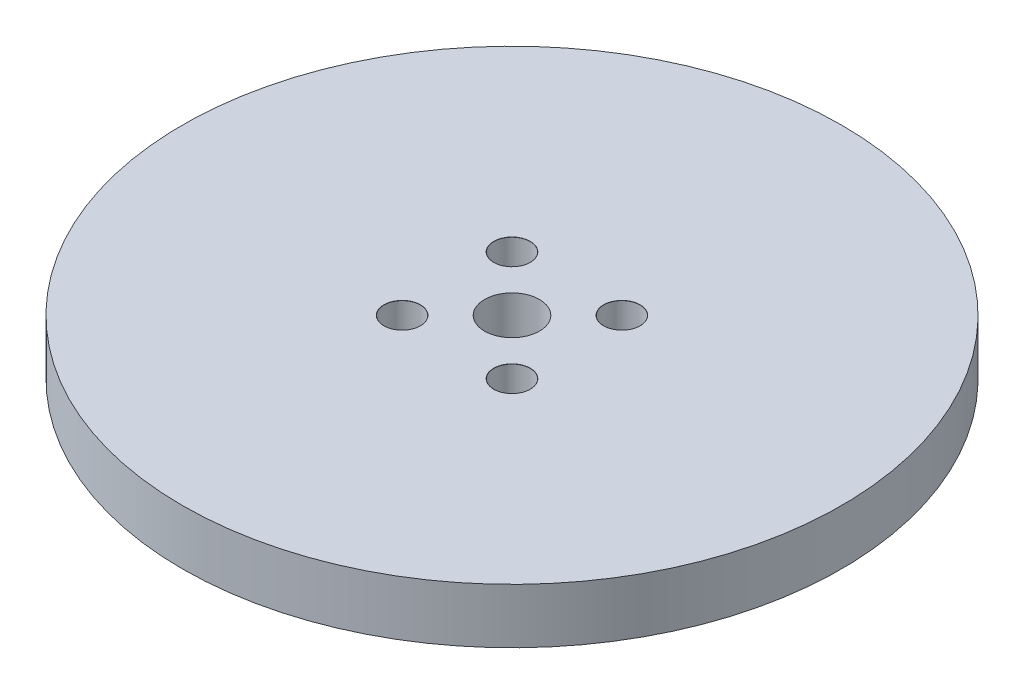
ISO-10303-21;
HEADER;
FILE_DESCRIPTION(('STEP AP214'),'2;1');
FILE_NAME('part.step','',(''),(''),'','','');
FILE_SCHEMA(('AUTOMOTIVE_DESIGN { 1 0 10303 214 1 1 1 1 }'));
ENDSEC;
DATA;
#1=APPLICATION_CONTEXT('core data for automotive mechanical design processes');
#2=APPLICATION_PROTOCOL_DEFINITION('international standard','automotive_design',2000,#1);
#3=PRODUCT_CONTEXT('',#1,'mechanical');
#4=PRODUCT('Part','Part','',(#3));
#5=PRODUCT_RELATED_PRODUCT_CATEGORY('part','',(#4));
#6=PRODUCT_DEFINITION_FORMATION('','',#4);
#7=PRODUCT_DEFINITION_CONTEXT('part definition',#1,'design');
#8=PRODUCT_DEFINITION('design','',#6,#7);
#9=PRODUCT_DEFINITION_SHAPE('','',#8);
#10=(LENGTH_UNIT() NAMED_UNIT(*) SI_UNIT(.MILLI.,.METRE.));
#11=(NAMED_UNIT(*) PLANE_ANGLE_UNIT() SI_UNIT($,.RADIAN.));
#12=(NAMED_UNIT(*) SI_UNIT($,.STERADIAN.) SOLID_ANGLE_UNIT());
#13=UNCERTAINTY_MEASURE_WITH_UNIT(LENGTH_MEASURE(1.E-05),#10,'distance_accuracy_value','');
#14=(GEOMETRIC_REPRESENTATION_CONTEXT(3) GLOBAL_UNCERTAINTY_ASSIGNED_CONTEXT((#13)) GLOBAL_UNIT_ASSIGNED_CONTEXT((#10,
#11,#12)) REPRESENTATION_CONTEXT('',''));
#15=CARTESIAN_POINT('',(0.,0.,0.));
#16=DIRECTION('',(0.,0.,1.));
#17=DIRECTION('',(1.,0.,0.));
#18=AXIS2_PLACEMENT_3D('',#15,#16,#17);
#19=CARTESIAN_POINT('',(0.,10.,0.));
#20=DIRECTION('',(0.,1.,0.));
#21=DIRECTION('',(0.,0.,1.));
#22=AXIS2_PLACEMENT_3D('',#19,#20,#21);
#23=PLANE('',#22);
#24=CARTESIAN_POINT('',(-10.,10.,-10.));
#25=DIRECTION('',(0.,1.,0.));
#26=DIRECTION('',(0.,0.,1.));
#27=AXIS2_PLACEMENT_3D('',#24,#25,#26);
#28=CIRCLE('',#27,3.325);
#29=CARTESIAN_POINT('',(-10.,10.,-6.675));
#30=VERTEX_POINT('',#29);
#31=EDGE_CURVE('E96',#30,#30,#28,.T.);
#32=ORIENTED_EDGE('',*,*,#31,.F.);
#33=EDGE_LOOP('',(#32));
#34=FACE_BOUND('',#33,.T.);
#35=CARTESIAN_POINT('',(10.,10.,-10.));
#36=DIRECTION('',(0.,1.,0.));
#37=DIRECTION('',(0.,0.,1.));
#38=AXIS2_PLACEMENT_3D('',#35,#36,#37);
#39=CIRCLE('',#38,3.325);
#40=CARTESIAN_POINT('',(10.,10.,-6.675));
#41=VERTEX_POINT('',#40);
#42=EDGE_CURVE('E87',#41,#41,#39,.T.);
#43=ORIENTED_EDGE('',*,*,#42,.F.);
#44=EDGE_LOOP('',(#43));
#45=FACE_BOUND('',#44,.T.);
#46=CARTESIAN_POINT('',(-10.,10.,10.));
#47=DIRECTION('',(0.,1.,0.));
#48=DIRECTION('',(0.,0.,1.));
#49=AXIS2_PLACEMENT_3D('',#46,#47,#48);
#50=CIRCLE('',#49,3.325);
#51=CARTESIAN_POINT('',(-10.,10.,13.325));
#52=VERTEX_POINT('',#51);
#53=EDGE_CURVE('E78',#52,#52,#50,.T.);
#54=ORIENTED_EDGE('',*,*,#53,.F.);
#55=EDGE_LOOP('',(#54));
#56=FACE_BOUND('',#55,.T.);
#57=CARTESIAN_POINT('',(10.,10.,10.));
#58=DIRECTION('',(0.,1.,0.));
#59=DIRECTION('',(0.,0.,1.));
#60=AXIS2_PLACEMENT_3D('',#57,#58,#59);
#61=CIRCLE('',#60,3.325);
#62=CARTESIAN_POINT('',(10.,10.,13.325));
#63=VERTEX_POINT('',#62);
#64=EDGE_CURVE('E69',#63,#63,#61,.T.);
#65=ORIENTED_EDGE('',*,*,#64,.F.);
#66=EDGE_LOOP('',(#65));
#67=FACE_BOUND('',#66,.T.);
#68=CARTESIAN_POINT('',(0.,10.,0.));
#69=DIRECTION('',(0.,1.,0.));
#70=DIRECTION('',(0.,0.,1.));
#71=AXIS2_PLACEMENT_3D('',#68,#69,#70);
#72=CIRCLE('',#71,60.0000000000001);
#73=CARTESIAN_POINT('',(0.,10.,60.0000000000001));
#74=VERTEX_POINT('',#73);
#75=EDGE_CURVE('E10',#74,#74,#72,.T.);
#76=ORIENTED_EDGE('',*,*,#75,.T.);
#77=EDGE_LOOP('',(#76));
#78=FACE_BOUND('',#77,.T.);
#79=CARTESIAN_POINT('',(0.,10.,0.));
#80=DIRECTION('',(0.,1.,0.));
#81=DIRECTION('',(0.,0.,1.));
#82=AXIS2_PLACEMENT_3D('',#79,#80,#81);
#83=CIRCLE('',#82,5.);
#84=CARTESIAN_POINT('',(0.,10.,5.));
#85=VERTEX_POINT('',#84);
#86=EDGE_CURVE('E56',#85,#85,#83,.T.);
#87=ORIENTED_EDGE('',*,*,#86,.F.);
#88=EDGE_LOOP('',(#87));
#89=FACE_BOUND('',#88,.T.);
#90=ADVANCED_FACE('F45',(#34,#45,#56,#67,#78,#89),#23,.T.);
#91=CARTESIAN_POINT('',(0.,0.,0.));
#92=DIRECTION('',(0.,1.,0.));
#93=DIRECTION('',(0.,0.,1.));
#94=AXIS2_PLACEMENT_3D('',#91,#92,#93);
#95=PLANE('',#94);
#96=CARTESIAN_POINT('',(-10.,0.,-10.));
#97=DIRECTION('',(0.,1.,0.));
#98=DIRECTION('',(0.,0.,1.));
#99=AXIS2_PLACEMENT_3D('',#96,#97,#98);
#100=CIRCLE('',#99,3.29999999999999);
#101=CARTESIAN_POINT('',(-10.,0.,-6.70000000000001));
#102=VERTEX_POINT('',#101);
#103=EDGE_CURVE('E90',#102,#102,#100,.T.);
#104=ORIENTED_EDGE('',*,*,#103,.T.);
#105=EDGE_LOOP('',(#104));
#106=FACE_BOUND('',#105,.T.);
#107=CARTESIAN_POINT('',(10.,0.,-10.));
#108=DIRECTION('',(0.,1.,0.));
#109=DIRECTION('',(0.,0.,1.));
#110=AXIS2_PLACEMENT_3D('',#107,#108,#109);
#111=CIRCLE('',#110,3.29999999999999);
#112=CARTESIAN_POINT('',(10.,0.,-6.70000000000001));
#113=VERTEX_POINT('',#112);
#114=EDGE_CURVE('E81',#113,#113,#111,.T.);
#115=ORIENTED_EDGE('',*,*,#114,.T.);
#116=EDGE_LOOP('',(#115));
#117=FACE_BOUND('',#116,.T.);
#118=CARTESIAN_POINT('',(-10.,0.,10.));
#119=DIRECTION('',(0.,1.,0.));
#120=DIRECTION('',(0.,0.,1.));
#121=AXIS2_PLACEMENT_3D('',#118,#119,#120);
#122=CIRCLE('',#121,3.29999999999999);
#123=CARTESIAN_POINT('',(-10.,0.,13.3));
#124=VERTEX_POINT('',#123);
#125=EDGE_CURVE('E72',#124,#124,#122,.T.);
#126=ORIENTED_EDGE('',*,*,#125,.T.);
#127=EDGE_LOOP('',(#126));
#128=FACE_BOUND('',#127,.T.);
#129=CARTESIAN_POINT('',(10.,0.,10.));
#130=DIRECTION('',(0.,1.,0.));
#131=DIRECTION('',(0.,0.,1.));
#132=AXIS2_PLACEMENT_3D('',#129,#130,#131);
#133=CIRCLE('',#132,3.29999999999999);
#134=CARTESIAN_POINT('',(10.,0.,13.3));
#135=VERTEX_POINT('',#134);
#136=EDGE_CURVE('E61',#135,#135,#133,.T.);
#137=ORIENTED_EDGE('',*,*,#136,.T.);
#138=EDGE_LOOP('',(#137));
#139=FACE_BOUND('',#138,.T.);
#140=CARTESIAN_POINT('',(0.,0.,0.));
#141=DIRECTION('',(0.,1.,0.));
#142=DIRECTION('',(0.,0.,1.));
#143=AXIS2_PLACEMENT_3D('',#140,#141,#142);
#144=CIRCLE('',#143,60.0000000000001);
#145=CARTESIAN_POINT('',(0.,0.,60.0000000000001));
#146=VERTEX_POINT('',#145);
#147=EDGE_CURVE('E49',#146,#146,#144,.T.);
#148=ORIENTED_EDGE('',*,*,#147,.F.);
#149=EDGE_LOOP('',(#148));
#150=FACE_BOUND('',#149,.T.);
#151=CARTESIAN_POINT('',(0.,0.,0.));
#152=DIRECTION('',(0.,1.,0.));
#153=DIRECTION('',(0.,0.,1.));
#154=AXIS2_PLACEMENT_3D('',#151,#152,#153);
#155=CIRCLE('',#154,5.);
#156=CARTESIAN_POINT('',(0.,0.,5.));
#157=VERTEX_POINT('',#156);
#158=EDGE_CURVE('E58',#157,#157,#155,.T.);
#159=ORIENTED_EDGE('',*,*,#158,.T.);
#160=EDGE_LOOP('',(#159));
#161=FACE_BOUND('',#160,.T.);
#162=ADVANCED_FACE('F104',(#106,#117,#128,#139,#150,#161),#95,.F.);
#163=CARTESIAN_POINT('',(0.,10.,0.));
#164=DIRECTION('',(0.,-1.,0.));
#165=DIRECTION('',(0.,0.,-1.));
#166=AXIS2_PLACEMENT_3D('',#163,#164,#165);
#167=CYLINDRICAL_SURFACE('',#166,60.0000000000001);
#168=ORIENTED_EDGE('',*,*,#75,.F.);
#169=EDGE_LOOP('',(#168));
#170=FACE_BOUND('',#169,.T.);
#171=ORIENTED_EDGE('',*,*,#147,.T.);
#172=EDGE_LOOP('',(#171));
#173=FACE_BOUND('',#172,.T.);
#174=ADVANCED_FACE('F47',(#170,#173),#167,.T.);
#175=CARTESIAN_POINT('',(0.,10.,0.));
#176=DIRECTION('',(0.,-1.,0.));
#177=DIRECTION('',(0.,0.,-1.));
#178=AXIS2_PLACEMENT_3D('',#175,#176,#177);
#179=CYLINDRICAL_SURFACE('',#178,5.);
#180=ORIENTED_EDGE('',*,*,#86,.T.);
#181=EDGE_LOOP('',(#180));
#182=FACE_BOUND('',#181,.T.);
#183=ORIENTED_EDGE('',*,*,#158,.F.);
#184=EDGE_LOOP('',(#183));
#185=FACE_BOUND('',#184,.T.);
#186=ADVANCED_FACE('F114',(#182,#185),#179,.F.);
#187=CARTESIAN_POINT('',(10.,10.,10.));
#188=DIRECTION('',(0.,1.,0.));
#189=DIRECTION('',(0.,0.,1.));
#190=AXIS2_PLACEMENT_3D('',#187,#188,#189);
#191=CYLINDRICAL_SURFACE('',#190,3.29999999999999);
#192=ORIENTED_EDGE('',*,*,#136,.F.);
#193=EDGE_LOOP('',(#192));
#194=FACE_BOUND('',#193,.T.);
#195=CARTESIAN_POINT('',(10.,9.97902250922056,10.));
#196=DIRECTION('',(0.,1.,0.));
#197=DIRECTION('',(0.,0.,1.));
#198=AXIS2_PLACEMENT_3D('',#195,#196,#197);
#199=CIRCLE('',#198,3.29999999999999);
#200=CARTESIAN_POINT('',(10.,9.97902250922056,13.3));
#201=VERTEX_POINT('',#200);
#202=EDGE_CURVE('E66',#201,#201,#199,.T.);
#203=ORIENTED_EDGE('',*,*,#202,.T.);
#204=EDGE_LOOP('',(#203));
#205=FACE_BOUND('',#204,.T.);
#206=ADVANCED_FACE('F117',(#194,#205),#191,.F.);
#207=CARTESIAN_POINT('',(10.,10.,10.));
#208=DIRECTION('',(0.,1.,0.));
#209=DIRECTION('',(0.,0.,1.));
#210=AXIS2_PLACEMENT_3D('',#207,#208,#209);
#211=CONICAL_SURFACE('',#210,3.325,0.872664625997276);
#212=ORIENTED_EDGE('',*,*,#202,.F.);
#213=EDGE_LOOP('',(#212));
#214=FACE_BOUND('',#213,.T.);
#215=ORIENTED_EDGE('',*,*,#64,.T.);
#216=EDGE_LOOP('',(#215));
#217=FACE_BOUND('',#216,.T.);
#218=ADVANCED_FACE('F131',(#214,#217),#211,.F.);
#219=CARTESIAN_POINT('',(-10.,10.,10.));
#220=DIRECTION('',(0.,1.,0.));
#221=DIRECTION('',(0.,0.,1.));
#222=AXIS2_PLACEMENT_3D('',#219,#220,#221);
#223=CYLINDRICAL_SURFACE('',#222,3.29999999999999);
#224=ORIENTED_EDGE('',*,*,#125,.F.);
#225=EDGE_LOOP('',(#224));
#226=FACE_BOUND('',#225,.T.);
#227=CARTESIAN_POINT('',(-10.,9.97902250922056,10.));
#228=DIRECTION('',(0.,1.,0.));
#229=DIRECTION('',(0.,0.,1.));
#230=AXIS2_PLACEMENT_3D('',#227,#228,#229);
#231=CIRCLE('',#230,3.29999999999999);
#232=CARTESIAN_POINT('',(-10.,9.97902250922056,13.3));
#233=VERTEX_POINT('',#232);
#234=EDGE_CURVE('E75',#233,#233,#231,.T.);
#235=ORIENTED_EDGE('',*,*,#234,.T.);
#236=EDGE_LOOP('',(#235));
#237=FACE_BOUND('',#236,.T.);
#238=ADVANCED_FACE('F135',(#226,#237),#223,.F.);
#239=CARTESIAN_POINT('',(-10.,10.,10.));
#240=DIRECTION('',(0.,1.,0.));
#241=DIRECTION('',(0.,0.,1.));
#242=AXIS2_PLACEMENT_3D('',#239,#240,#241);
#243=CONICAL_SURFACE('',#242,3.325,0.872664625997276);
#244=ORIENTED_EDGE('',*,*,#234,.F.);
#245=EDGE_LOOP('',(#244));
#246=FACE_BOUND('',#245,.T.);
#247=ORIENTED_EDGE('',*,*,#53,.T.);
#248=EDGE_LOOP('',(#247));
#249=FACE_BOUND('',#248,.T.);
#250=ADVANCED_FACE('F139',(#246,#249),#243,.F.);
#251=CARTESIAN_POINT('',(10.,10.,-10.));
#252=DIRECTION('',(0.,1.,0.));
#253=DIRECTION('',(0.,0.,1.));
#254=AXIS2_PLACEMENT_3D('',#251,#252,#253);
#255=CYLINDRICAL_SURFACE('',#254,3.29999999999999);
#256=ORIENTED_EDGE('',*,*,#114,.F.);
#257=EDGE_LOOP('',(#256));
#258=FACE_BOUND('',#257,.T.);
#259=CARTESIAN_POINT('',(10.,9.97902250922056,-10.));
#260=DIRECTION('',(0.,1.,0.));
#261=DIRECTION('',(0.,0.,1.));
#262=AXIS2_PLACEMENT_3D('',#259,#260,#261);
#263=CIRCLE('',#262,3.29999999999999);
#264=CARTESIAN_POINT('',(10.,9.97902250922056,-6.70000000000001));
#265=VERTEX_POINT('',#264);
#266=EDGE_CURVE('E84',#265,#265,#263,.T.);
#267=ORIENTED_EDGE('',*,*,#266,.T.);
#268=EDGE_LOOP('',(#267));
#269=FACE_BOUND('',#268,.T.);
#270=ADVANCED_FACE('F143',(#258,#269),#255,.F.);
#271=CARTESIAN_POINT('',(10.,10.,-10.));
#272=DIRECTION('',(0.,1.,0.));
#273=DIRECTION('',(0.,0.,1.));
#274=AXIS2_PLACEMENT_3D('',#271,#272,#273);
#275=CONICAL_SURFACE('',#274,3.325,0.872664625997276);
#276=ORIENTED_EDGE('',*,*,#266,.F.);
#277=EDGE_LOOP('',(#276));
#278=FACE_BOUND('',#277,.T.);
#279=ORIENTED_EDGE('',*,*,#42,.T.);
#280=EDGE_LOOP('',(#279));
#281=FACE_BOUND('',#280,.T.);
#282=ADVANCED_FACE('F147',(#278,#281),#275,.F.);
#283=CARTESIAN_POINT('',(-10.,10.,-10.));
#284=DIRECTION('',(0.,1.,0.));
#285=DIRECTION('',(0.,0.,1.));
#286=AXIS2_PLACEMENT_3D('',#283,#284,#285);
#287=CYLINDRICAL_SURFACE('',#286,3.29999999999999);
#288=ORIENTED_EDGE('',*,*,#103,.F.);
#289=EDGE_LOOP('',(#288));
#290=FACE_BOUND('',#289,.T.);
#291=CARTESIAN_POINT('',(-10.,9.97902250922056,-10.));
#292=DIRECTION('',(0.,1.,0.));
#293=DIRECTION('',(0.,0.,1.));
#294=AXIS2_PLACEMENT_3D('',#291,#292,#293);
#295=CIRCLE('',#294,3.29999999999999);
#296=CARTESIAN_POINT('',(-10.,9.97902250922056,-6.70000000000001));
#297=VERTEX_POINT('',#296);
#298=EDGE_CURVE('E93',#297,#297,#295,.T.);
#299=ORIENTED_EDGE('',*,*,#298,.T.);
#300=EDGE_LOOP('',(#299));
#301=FACE_BOUND('',#300,.T.);
#302=ADVANCED_FACE('F151',(#290,#301),#287,.F.);
#303=CARTESIAN_POINT('',(-10.,10.,-10.));
#304=DIRECTION('',(0.,1.,0.));
#305=DIRECTION('',(0.,0.,1.));
#306=AXIS2_PLACEMENT_3D('',#303,#304,#305);
#307=CONICAL_SURFACE('',#306,3.325,0.872664625997276);
#308=ORIENTED_EDGE('',*,*,#298,.F.);
#309=EDGE_LOOP('',(#308));
#310=FACE_BOUND('',#309,.T.);
#311=ORIENTED_EDGE('',*,*,#31,.T.);
#312=EDGE_LOOP('',(#311));
#313=FACE_BOUND('',#312,.T.);
#314=ADVANCED_FACE('F100',(#310,#313),#307,.F.);
#315=CLOSED_SHELL('',(#90,#162,#174,#186,#206,#218,#238,#250,#270,#282,#302,#314));
#316=MANIFOLD_SOLID_BREP('B2',#315);
#317=ADVANCED_BREP_SHAPE_REPRESENTATION('',(#18,#316),#14);
#318=SHAPE_DEFINITION_REPRESENTATION(#9,#317);
ENDSEC;
END-ISO-10303-21;
